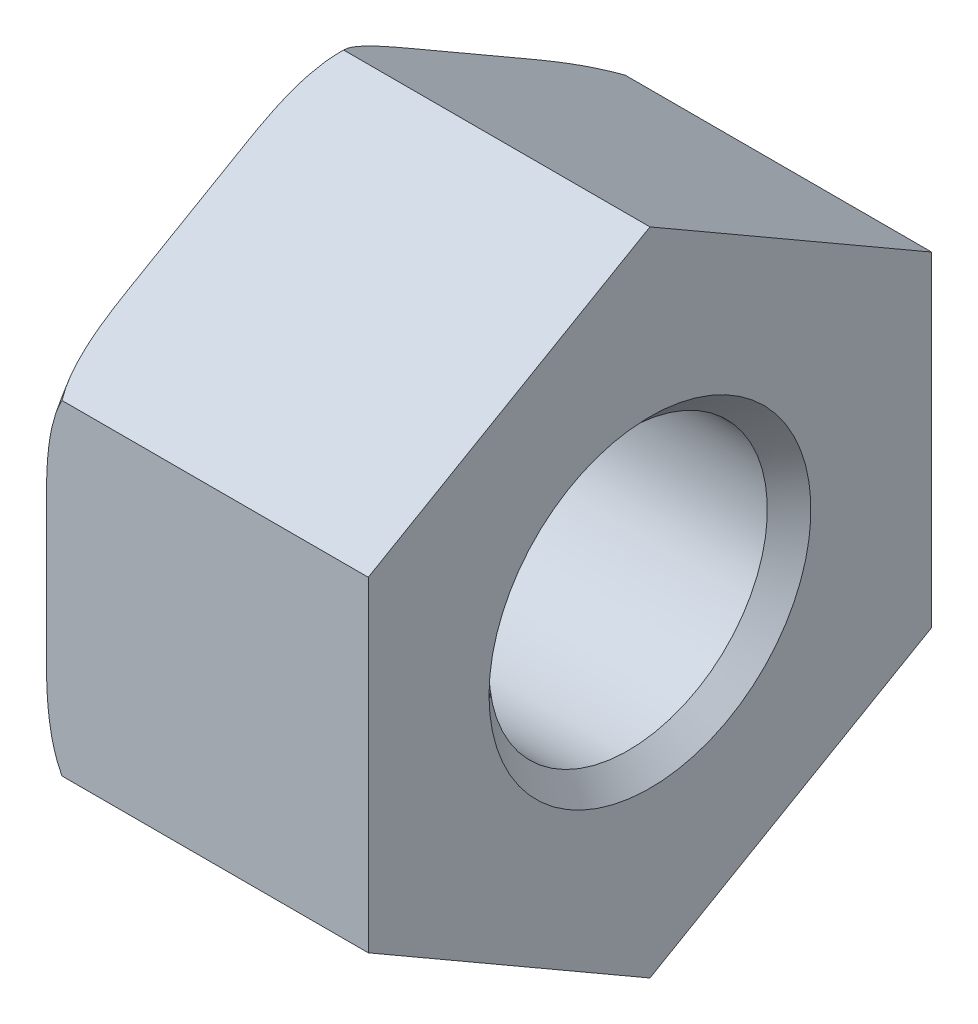
ISO-10303-21;
HEADER;
FILE_DESCRIPTION(('STEP AP214'),'2;1');
FILE_NAME('part.step','',(''),(''),'','','');
FILE_SCHEMA(('AUTOMOTIVE_DESIGN { 1 0 10303 214 1 1 1 1 }'));
ENDSEC;
DATA;
#1=APPLICATION_CONTEXT('core data for automotive mechanical design processes');
#2=APPLICATION_PROTOCOL_DEFINITION('international standard','automotive_design',2000,#1);
#3=PRODUCT_CONTEXT('',#1,'mechanical');
#4=PRODUCT('Part','Part','',(#3));
#5=PRODUCT_RELATED_PRODUCT_CATEGORY('part','',(#4));
#6=PRODUCT_DEFINITION_FORMATION('','',#4);
#7=PRODUCT_DEFINITION_CONTEXT('part definition',#1,'design');
#8=PRODUCT_DEFINITION('design','',#6,#7);
#9=PRODUCT_DEFINITION_SHAPE('','',#8);
#10=(LENGTH_UNIT() NAMED_UNIT(*) SI_UNIT(.MILLI.,.METRE.));
#11=(NAMED_UNIT(*) PLANE_ANGLE_UNIT() SI_UNIT($,.RADIAN.));
#12=(NAMED_UNIT(*) SI_UNIT($,.STERADIAN.) SOLID_ANGLE_UNIT());
#13=UNCERTAINTY_MEASURE_WITH_UNIT(LENGTH_MEASURE(1.E-05),#10,'distance_accuracy_value','');
#14=(GEOMETRIC_REPRESENTATION_CONTEXT(3) GLOBAL_UNCERTAINTY_ASSIGNED_CONTEXT((#13)) GLOBAL_UNIT_ASSIGNED_CONTEXT((#10,
#11,#12)) REPRESENTATION_CONTEXT('',''));
#15=CARTESIAN_POINT('',(0.,0.,0.));
#16=DIRECTION('',(0.,0.,1.));
#17=DIRECTION('',(1.,0.,0.));
#18=AXIS2_PLACEMENT_3D('',#15,#16,#17);
#19=CARTESIAN_POINT('',(2.,4.04145188432738,0.));
#20=DIRECTION('',(0.,-0.866025403784439,0.5));
#21=DIRECTION('',(0.,-0.5,-0.866025403784439));
#22=AXIS2_PLACEMENT_3D('',#19,#20,#21);
#23=PLANE('',#22);
#24=CARTESIAN_POINT('',(-1.80634989088691,4.04145188432738,0.));
#25=CARTESIAN_POINT('',(-1.81783862174649,4.03086842270327,-0.0183310932529214));
#26=CARTESIAN_POINT('',(-1.82853336500855,4.02007874790552,-0.0370193581997551));
#27=CARTESIAN_POINT('',(-1.84846631757347,3.99820767446532,-0.0749011686142629));
#28=CARTESIAN_POINT('',(-1.85770898528877,3.98712729571929,-0.0940929475694885));
#29=CARTESIAN_POINT('',(-1.87493292089598,3.96473623926647,-0.13287539498091));
#30=CARTESIAN_POINT('',(-1.88291509877473,3.95342573441573,-0.152465764041649));
#31=CARTESIAN_POINT('',(-1.89768346054286,3.93074778997109,-0.191745116030986));
#32=CARTESIAN_POINT('',(-1.90448167223158,3.91938229694458,-0.211430727405979));
#33=CARTESIAN_POINT('',(-1.9171104004526,3.89650998699946,-0.251046730317397));
#34=CARTESIAN_POINT('',(-1.9229402307188,3.88500307601155,-0.270977284786624));
#35=CARTESIAN_POINT('',(-1.93373254480891,3.86188639244803,-0.311016555221125));
#36=CARTESIAN_POINT('',(-1.93869484680042,3.8502765988429,-0.3311253076106));
#37=CARTESIAN_POINT('',(-1.95149149792549,3.81770291658341,-0.387544580273639));
#38=CARTESIAN_POINT('',(-1.95846514017973,3.79665415394161,-0.424002106605699));
#39=CARTESIAN_POINT('',(-1.97038933603838,3.75441334903892,-0.497165326849758));
#40=CARTESIAN_POINT('',(-1.97533934120471,3.73322126951665,-0.53387108530038));
#41=CARTESIAN_POINT('',(-1.98361108023124,3.69074282887347,-0.607445902720663));
#42=CARTESIAN_POINT('',(-1.9869315236959,3.66945640645997,-0.644315067852212));
#43=CARTESIAN_POINT('',(-1.99233272320532,3.62639683112319,-0.718896440087865));
#44=CARTESIAN_POINT('',(-1.99438596179558,3.60462284999449,-0.756610081685814));
#45=CARTESIAN_POINT('',(-1.99745567841317,3.5610789024268,-0.832030411235169));
#46=CARTESIAN_POINT('',(-1.99847314506668,3.53930895202647,-0.86973707140679));
#47=CARTESIAN_POINT('',(-1.99974139498009,3.49582399485081,-0.945055226599997));
#48=CARTESIAN_POINT('',(-1.99999431507051,3.47410900474213,-0.982666692754078));
#49=CARTESIAN_POINT('',(-2.,3.45239640190435,-1.02027402403368));
#50=B_SPLINE_CURVE_WITH_KNOTS('',3,(#24,#25,#26,#27,#28,#29,#30,#31,#32,#33,#34,#35,#36,#37,#38,
#39,#40,#41,#42,#43,#44,#45,#46,#47,#48,#49),.UNSPECIFIED.,.F.,.F.,(4,2,2,2,2,2,2,2,2,2,2,2,4),
(0.,0.0722112344197849,0.14419622751732,0.216129012451316,0.287281963363904,0.358485125314697,
0.429703193477565,0.557648536624009,0.685628532058089,0.813709707714387,0.944482417824718,
1.07513019030958,1.20541247626749),.UNSPECIFIED.);
#51=CARTESIAN_POINT('',(-1.80634989088691,4.04145188432738,0.));
#52=VERTEX_POINT('',#51);
#53=CARTESIAN_POINT('',(-2.,3.45239640190435,-1.02027402403368));
#54=VERTEX_POINT('',#53);
#55=EDGE_CURVE('E239',#52,#54,#50,.T.);
#56=ORIENTED_EDGE('',*,*,#55,.F.);
#57=DIRECTION('',(-1.,0.,0.));
#58=VECTOR('',#57,1.);
#59=CARTESIAN_POINT('',(2.,4.04145188432738,0.));
#60=LINE('',#59,#58);
#61=CARTESIAN_POINT('',(2.,4.04145188432738,0.));
#62=VERTEX_POINT('',#61);
#63=EDGE_CURVE('E153',#62,#52,#60,.T.);
#64=ORIENTED_EDGE('',*,*,#63,.F.);
#65=DIRECTION('',(0.,0.5,0.866025403784439));
#66=VECTOR('',#65,1.);
#67=CARTESIAN_POINT('',(2.,4.04145188432738,0.));
#68=LINE('',#67,#66);
#69=CARTESIAN_POINT('',(2.,2.02072594216369,-3.5));
#70=VERTEX_POINT('',#69);
#71=EDGE_CURVE('E147',#70,#62,#68,.T.);
#72=ORIENTED_EDGE('',*,*,#71,.F.);
#73=DIRECTION('',(-1.,0.,0.));
#74=VECTOR('',#73,1.);
#75=CARTESIAN_POINT('',(2.,2.02072594216369,-3.5));
#76=LINE('',#75,#74);
#77=CARTESIAN_POINT('',(-1.80634989088691,2.02072594216369,-3.5));
#78=VERTEX_POINT('',#77);
#79=EDGE_CURVE('E151',#70,#78,#76,.T.);
#80=ORIENTED_EDGE('',*,*,#79,.T.);
#81=CARTESIAN_POINT('',(-2.,2.60978142458672,-2.47972597596632));
#82=CARTESIAN_POINT('',(-1.99999279681051,2.58679180770473,-2.5195451604526));
#83=CARTESIAN_POINT('',(-1.99971001746312,2.5637991940644,-2.55936953547639));
#84=CARTESIAN_POINT('',(-1.99827150388803,2.51773082673427,-2.63916228831378));
#85=CARTESIAN_POINT('',(-1.99711234006011,2.49465510178781,-2.67913061634247));
#86=CARTESIAN_POINT('',(-1.99359181377069,2.44849231389778,-2.75908691038729));
#87=CARTESIAN_POINT('',(-1.99122877881935,2.42540527994102,-2.79907482619679));
#88=CARTESIAN_POINT('',(-1.98498834259843,2.37981575983831,-2.87803819130648));
#89=CARTESIAN_POINT('',(-1.98114712528523,2.35731207266693,-2.91701572084375));
#90=CARTESIAN_POINT('',(-1.97154260941606,2.31242884035369,-2.99475575962146));
#91=CARTESIAN_POINT('',(-1.96578155155552,2.29004918126801,-3.0335184662184));
#92=CARTESIAN_POINT('',(-1.95185263590721,2.24549385742031,-3.1106905508581));
#93=CARTESIAN_POINT('',(-1.94368628660028,2.2233180737595,-3.14910013483963));
#94=CARTESIAN_POINT('',(-1.92037545482163,2.17018657823576,-3.24112658456285));
#95=CARTESIAN_POINT('',(-1.90374216915183,2.13937778528848,-3.29448897929212));
#96=CARTESIAN_POINT('',(-1.87609751062025,2.09913200475287,-3.36419671597547));
#97=CARTESIAN_POINT('',(-1.86867320248732,2.08907155769785,-3.38162192142065));
#98=CARTESIAN_POINT('',(-1.85279019180505,2.06914743556683,-3.41613151324703));
#99=CARTESIAN_POINT('',(-1.84433089615542,2.059283877119,-3.43321569762231));
#100=CARTESIAN_POINT('',(-1.82624414522171,2.03979964879718,-3.46696337102228));
#101=CARTESIAN_POINT('',(-1.81661387067167,2.03017963528796,-3.48362572318982));
#102=CARTESIAN_POINT('',(-1.80634989088704,2.02072594216349,-3.49999999999985));
#103=B_SPLINE_CURVE_WITH_KNOTS('',3,(#81,#82,#83,#84,#85,#86,#87,#88,#89,#90,#91,#92,#93,#94,
#95,#96,#97,#98,#99,#100,#101,#102),.UNSPECIFIED.,.F.,.F.,(4,2,2,2,2,2,2,2,2,2,4),(0.,
0.137946077412208,0.276434798590112,0.415116443385935,0.550599568925925,0.685925119212068,
0.821165980007636,1.01212668965685,1.07644656903175,1.14080348112746,1.20531852759574),.UNSPECIFIED.);
#104=CARTESIAN_POINT('',(-2.,2.60978142458672,-2.47972597596632));
#105=VERTEX_POINT('',#104);
#106=EDGE_CURVE('E183',#105,#78,#103,.T.);
#107=ORIENTED_EDGE('',*,*,#106,.F.);
#108=DIRECTION('',(0.,-0.499999999999998,-0.86602540378444));
#109=VECTOR('',#108,1.);
#110=CARTESIAN_POINT('',(-2.,3.45239640190435,-1.02027402403368));
#111=LINE('',#110,#109);
#112=EDGE_CURVE('E59',#54,#105,#111,.T.);
#113=ORIENTED_EDGE('',*,*,#112,.F.);
#114=EDGE_LOOP('',(#56,#64,#72,#80,#107,#113));
#115=FACE_BOUND('',#114,.T.);
#116=ADVANCED_FACE('F42',(#115),#23,.F.);
#117=CARTESIAN_POINT('',(2.,2.02072594216369,3.5));
#118=DIRECTION('',(0.,-0.866025403784439,-0.5));
#119=DIRECTION('',(0.,0.5,-0.866025403784439));
#120=AXIS2_PLACEMENT_3D('',#117,#118,#119);
#121=PLANE('',#120);
#122=CARTESIAN_POINT('',(-1.80634989088691,2.02072594216369,3.5));
#123=CARTESIAN_POINT('',(-1.81783862174649,2.0313094037878,3.48166890674708));
#124=CARTESIAN_POINT('',(-1.82853336500855,2.04209907858555,3.46298064180025));
#125=CARTESIAN_POINT('',(-1.84846631757347,2.06397015202575,3.42509883138574));
#126=CARTESIAN_POINT('',(-1.85770898528877,2.07505053077178,3.40590705243051));
#127=CARTESIAN_POINT('',(-1.87493292089598,2.0974415872246,3.36712460501909));
#128=CARTESIAN_POINT('',(-1.88291509877473,2.10875209207534,3.34753423595835));
#129=CARTESIAN_POINT('',(-1.89768346054286,2.13143003651997,3.30825488396902));
#130=CARTESIAN_POINT('',(-1.90448167223158,2.14279552954649,3.28856927259402));
#131=CARTESIAN_POINT('',(-1.9171104004526,2.16566783949161,3.2489532696826));
#132=CARTESIAN_POINT('',(-1.9229402307188,2.17717475047952,3.22902271521338));
#133=CARTESIAN_POINT('',(-1.93373254480891,2.20029143404304,3.18898344477888));
#134=CARTESIAN_POINT('',(-1.93869484680041,2.21190122764817,3.1688746923894));
#135=CARTESIAN_POINT('',(-1.95149149792549,2.24447490990765,3.11245541972636));
#136=CARTESIAN_POINT('',(-1.95846514017973,2.26552367254946,3.0759978933943));
#137=CARTESIAN_POINT('',(-1.97038933603838,2.30776447745214,3.00283467315024));
#138=CARTESIAN_POINT('',(-1.97533934120471,2.32895655697442,2.96612891469962));
#139=CARTESIAN_POINT('',(-1.98361108023124,2.3714349976176,2.89255409727934));
#140=CARTESIAN_POINT('',(-1.9869315236959,2.3927214200311,2.85568493214779));
#141=CARTESIAN_POINT('',(-1.99233272320532,2.43578099536788,2.78110355991214));
#142=CARTESIAN_POINT('',(-1.99438596179558,2.45755497649658,2.74338991831419));
#143=CARTESIAN_POINT('',(-1.99745567841317,2.50109892406427,2.66796958876483));
#144=CARTESIAN_POINT('',(-1.99847314506668,2.5228688744646,2.63026292859321));
#145=CARTESIAN_POINT('',(-1.9997413949801,2.56635383164026,2.5549447734));
#146=CARTESIAN_POINT('',(-1.99999431507051,2.58806882174894,2.51733330724592));
#147=CARTESIAN_POINT('',(-2.,2.60978142458672,2.47972597596632));
#148=B_SPLINE_CURVE_WITH_KNOTS('',3,(#122,#123,#124,#125,#126,#127,#128,#129,#130,#131,#132,
#133,#134,#135,#136,#137,#138,#139,#140,#141,#142,#143,#144,#145,#146,#147),.UNSPECIFIED.,.F.,
.F.,(4,2,2,2,2,2,2,2,2,2,2,2,4),(0.,0.0722112344197846,0.14419622751732,0.216129012451315,
0.287281963363903,0.358485125314694,0.429703193477561,0.557648536624006,0.685628532058087,
0.813709707714385,0.944482417824717,1.07513019030958,1.20541247626749),.UNSPECIFIED.);
#149=CARTESIAN_POINT('',(-1.80634989088691,2.02072594216369,3.5));
#150=VERTEX_POINT('',#149);
#151=CARTESIAN_POINT('',(-2.,2.60978142458672,2.47972597596632));
#152=VERTEX_POINT('',#151);
#153=EDGE_CURVE('E412',#150,#152,#148,.T.);
#154=ORIENTED_EDGE('',*,*,#153,.F.);
#155=DIRECTION('',(-1.,0.,0.));
#156=VECTOR('',#155,1.);
#157=CARTESIAN_POINT('',(2.,2.02072594216369,3.5));
#158=LINE('',#157,#156);
#159=CARTESIAN_POINT('',(2.,2.02072594216369,3.5));
#160=VERTEX_POINT('',#159);
#161=EDGE_CURVE('E172',#160,#150,#158,.T.);
#162=ORIENTED_EDGE('',*,*,#161,.F.);
#163=DIRECTION('',(0.,-0.5,0.866025403784439));
#164=VECTOR('',#163,1.);
#165=CARTESIAN_POINT('',(2.,2.02072594216369,3.5));
#166=LINE('',#165,#164);
#167=EDGE_CURVE('E156',#62,#160,#166,.T.);
#168=ORIENTED_EDGE('',*,*,#167,.F.);
#169=ORIENTED_EDGE('',*,*,#63,.T.);
#170=CARTESIAN_POINT('',(-2.,3.45239640190435,1.02027402403368));
#171=CARTESIAN_POINT('',(-1.99999279681051,3.47538601878645,0.980454839547465));
#172=CARTESIAN_POINT('',(-1.99971001746312,3.49837863242673,0.940630464523643));
#173=CARTESIAN_POINT('',(-1.99827150388803,3.54444699975674,0.860837711686185));
#174=CARTESIAN_POINT('',(-1.99711234006011,3.56752272470315,0.820869383657463));
#175=CARTESIAN_POINT('',(-1.99359181377069,3.6136855125934,0.74091308961277));
#176=CARTESIAN_POINT('',(-1.99122877881935,3.63677254655045,0.700925173803432));
#177=CARTESIAN_POINT('',(-1.98498834259843,3.68236206665238,0.621961808693298));
#178=CARTESIAN_POINT('',(-1.98114712528523,3.70486575382273,0.58298427915543));
#179=CARTESIAN_POINT('',(-1.97154260941606,3.7497489861388,0.505244240379354));
#180=CARTESIAN_POINT('',(-1.96578155155552,3.77212864522835,0.466481533784647));
#181=CARTESIAN_POINT('',(-1.95185263590721,3.81668396906548,0.38930944913884));
#182=CARTESIAN_POINT('',(-1.94368628660027,3.83885975271187,0.350899865148988));
#183=CARTESIAN_POINT('',(-1.92037545482163,3.89199124823041,0.258873415422757));
#184=CARTESIAN_POINT('',(-1.90374216915183,3.92280004119909,0.205511020705849));
#185=CARTESIAN_POINT('',(-1.87609751062025,3.96304582173938,0.135803284025205));
#186=CARTESIAN_POINT('',(-1.86867320248732,3.97310626879355,0.118378078579532));
#187=CARTESIAN_POINT('',(-1.85279019180505,3.99303039092392,0.08386848675278));
#188=CARTESIAN_POINT('',(-1.84433089615542,4.00289394937194,0.0667843023776117));
#189=CARTESIAN_POINT('',(-1.82624414522172,4.02237817769402,0.0330366289777953));
#190=CARTESIAN_POINT('',(-1.81661387067167,4.0319981912033,0.0163742768102843));
#191=CARTESIAN_POINT('',(-1.80634989088704,4.04145188432715,-1.05709711817337E-13));
#192=B_SPLINE_CURVE_WITH_KNOTS('',3,(#170,#171,#172,#173,#174,#175,#176,#177,#178,#179,#180,
#181,#182,#183,#184,#185,#186,#187,#188,#189,#190,#191),.UNSPECIFIED.,.F.,.F.,(4,2,2,2,2,2,2,2,
2,2,4),(0.,0.13794607741221,0.276434798590115,0.41511644338594,0.550599568925931,
0.685925119212075,0.821165980007645,1.01212668965686,1.07644656903175,1.14080348112746,
1.20531852759575),.UNSPECIFIED.);
#193=CARTESIAN_POINT('',(-2.,3.45239640190435,1.02027402403368));
#194=VERTEX_POINT('',#193);
#195=EDGE_CURVE('E378',#194,#52,#192,.T.);
#196=ORIENTED_EDGE('',*,*,#195,.F.);
#197=DIRECTION('',(0.,0.499999999999998,-0.86602540378444));
#198=VECTOR('',#197,1.);
#199=CARTESIAN_POINT('',(-2.,2.60978142458672,2.47972597596632));
#200=LINE('',#199,#198);
#201=EDGE_CURVE('E413',#152,#194,#200,.T.);
#202=ORIENTED_EDGE('',*,*,#201,.F.);
#203=EDGE_LOOP('',(#154,#162,#168,#169,#196,#202));
#204=FACE_BOUND('',#203,.T.);
#205=ADVANCED_FACE('F207',(#204),#121,.F.);
#206=CARTESIAN_POINT('',(2.,-2.02072594216369,3.5));
#207=DIRECTION('',(0.,0.,-1.));
#208=DIRECTION('',(-1.,0.,0.));
#209=AXIS2_PLACEMENT_3D('',#206,#207,#208);
#210=PLANE('',#209);
#211=CARTESIAN_POINT('',(-1.80634989088691,-2.02072594216369,3.5));
#212=CARTESIAN_POINT('',(-1.81783862174649,-1.99955901891546,3.5));
#213=CARTESIAN_POINT('',(-1.82853336500855,-1.97797966931998,3.5));
#214=CARTESIAN_POINT('',(-1.84846631757347,-1.93423752243957,3.5));
#215=CARTESIAN_POINT('',(-1.85770898528877,-1.91207676494751,3.5));
#216=CARTESIAN_POINT('',(-1.87493292089598,-1.86729465204188,3.5));
#217=CARTESIAN_POINT('',(-1.88291509877473,-1.8446736423404,3.5));
#218=CARTESIAN_POINT('',(-1.89768346054286,-1.79931775345112,3.5));
#219=CARTESIAN_POINT('',(-1.90448167223158,-1.77658676739809,3.5));
#220=CARTESIAN_POINT('',(-1.9171104004526,-1.73084214750784,3.5));
#221=CARTESIAN_POINT('',(-1.9229402307188,-1.70782832553203,3.5));
#222=CARTESIAN_POINT('',(-1.93373254480891,-1.661594958405,3.5));
#223=CARTESIAN_POINT('',(-1.93869484680041,-1.63837537119474,3.5));
#224=CARTESIAN_POINT('',(-1.95149149792549,-1.57322800667576,3.5));
#225=CARTESIAN_POINT('',(-1.95846514017973,-1.53113048139215,3.5));
#226=CARTESIAN_POINT('',(-1.97038933603838,-1.44664887158678,3.5));
#227=CARTESIAN_POINT('',(-1.97533934120471,-1.40426471254223,3.5));
#228=CARTESIAN_POINT('',(-1.98361108023124,-1.31930783125587,3.5));
#229=CARTESIAN_POINT('',(-1.9869315236959,-1.27673498642888,3.5));
#230=CARTESIAN_POINT('',(-1.99233272320532,-1.19061583575531,3.5));
#231=CARTESIAN_POINT('',(-1.99438596179558,-1.14706787349791,3.5));
#232=CARTESIAN_POINT('',(-1.99745567841317,-1.05997997836253,3.5));
#233=CARTESIAN_POINT('',(-1.99847314506668,-1.01644007756188,3.5));
#234=CARTESIAN_POINT('',(-1.9997413949801,-0.929470163210547,3.5));
#235=CARTESIAN_POINT('',(-1.99999431507051,-0.886040182993196,3.5));
#236=CARTESIAN_POINT('',(-2.,-0.842614977317633,3.5));
#237=B_SPLINE_CURVE_WITH_KNOTS('',3,(#211,#212,#213,#214,#215,#216,#217,#218,#219,#220,#221,
#222,#223,#224,#225,#226,#227,#228,#229,#230,#231,#232,#233,#234,#235,#236),.UNSPECIFIED.,.F.,
.F.,(4,2,2,2,2,2,2,2,2,2,2,2,4),(0.,0.0722112344197847,0.14419622751732,0.216129012451316,
0.287281963363903,0.358485125314695,0.429703193477563,0.557648536624008,0.685628532058089,
0.813709707714387,0.944482417824719,1.07513019030958,1.20541247626749),.UNSPECIFIED.);
#238=CARTESIAN_POINT('',(-1.80634989088691,-2.02072594216369,3.5));
#239=VERTEX_POINT('',#238);
#240=CARTESIAN_POINT('',(-2.,-0.842614977317631,3.5));
#241=VERTEX_POINT('',#240);
#242=EDGE_CURVE('E114',#239,#241,#237,.T.);
#243=ORIENTED_EDGE('',*,*,#242,.F.);
#244=DIRECTION('',(-1.,0.,0.));
#245=VECTOR('',#244,1.);
#246=CARTESIAN_POINT('',(2.,-2.02072594216369,3.5));
#247=LINE('',#246,#245);
#248=CARTESIAN_POINT('',(2.,-2.02072594216369,3.5));
#249=VERTEX_POINT('',#248);
#250=EDGE_CURVE('E398',#249,#239,#247,.T.);
#251=ORIENTED_EDGE('',*,*,#250,.F.);
#252=DIRECTION('',(0.,-1.,0.));
#253=VECTOR('',#252,1.);
#254=CARTESIAN_POINT('',(2.,-2.02072594216369,3.5));
#255=LINE('',#254,#253);
#256=EDGE_CURVE('E410',#160,#249,#255,.T.);
#257=ORIENTED_EDGE('',*,*,#256,.F.);
#258=ORIENTED_EDGE('',*,*,#161,.T.);
#259=CARTESIAN_POINT('',(-2.,0.84261497731763,3.5));
#260=CARTESIAN_POINT('',(-1.99999279681051,0.888594211081723,3.50000000000006));
#261=CARTESIAN_POINT('',(-1.99971001746312,0.934579438362329,3.50000000000003));
#262=CARTESIAN_POINT('',(-1.99827150388803,1.02671617302247,3.49999999999997));
#263=CARTESIAN_POINT('',(-1.99711234006011,1.07286762291533,3.49999999999994));
#264=CARTESIAN_POINT('',(-1.99359181377069,1.16519319869562,3.50000000000007));
#265=CARTESIAN_POINT('',(-1.99122877881935,1.21136726660943,3.50000000000023));
#266=CARTESIAN_POINT('',(-1.98498834259843,1.30254630681407,3.49999999999978));
#267=CARTESIAN_POINT('',(-1.98114712528523,1.3475536811558,3.49999999999918));
#268=CARTESIAN_POINT('',(-1.97154260941606,1.4373201457851,3.50000000000082));
#269=CARTESIAN_POINT('',(-1.96578155155552,1.48207946396034,3.50000000000305));
#270=CARTESIAN_POINT('',(-1.95185263590721,1.57119011164518,3.49999999999695));
#271=CARTESIAN_POINT('',(-1.94368628660027,1.61554167895237,3.49999999998862));
#272=CARTESIAN_POINT('',(-1.92037545482163,1.72180466999465,3.49999999998562));
#273=CARTESIAN_POINT('',(-1.90374216915183,1.78342225591061,3.49999999999798));
#274=CARTESIAN_POINT('',(-1.87609751062025,1.86391381698651,3.50000000000068));
#275=CARTESIAN_POINT('',(-1.86867320248732,1.88403471109571,3.50000000000019));
#276=CARTESIAN_POINT('',(-1.85279019180505,1.92388295535709,3.49999999999981));
#277=CARTESIAN_POINT('',(-1.84433089615542,1.94361007225293,3.49999999999993));
#278=CARTESIAN_POINT('',(-1.82624414522171,1.98257852889683,3.50000000000007));
#279=CARTESIAN_POINT('',(-1.81661387067167,2.00181855591534,3.50000000000011));
#280=CARTESIAN_POINT('',(-1.80634989088704,2.02072594216367,3.49999999999975));
#281=B_SPLINE_CURVE_WITH_KNOTS('',3,(#259,#260,#261,#262,#263,#264,#265,#266,#267,#268,#269,
#270,#271,#272,#273,#274,#275,#276,#277,#278,#279,#280),.UNSPECIFIED.,.F.,.F.,(4,2,2,2,2,2,2,2,
2,2,4),(0.,0.13794607741221,0.276434798590115,0.41511644338594,0.550599568925931,
0.685925119212075,0.821165980007645,1.01212668965686,1.07644656903175,1.14080348112746,
1.20531852759575),.UNSPECIFIED.);
#282=CARTESIAN_POINT('',(-2.,0.84261497731763,3.5));
#283=VERTEX_POINT('',#282);
#284=EDGE_CURVE('E241',#283,#150,#281,.T.);
#285=ORIENTED_EDGE('',*,*,#284,.F.);
#286=DIRECTION('',(0.,1.,0.));
#287=VECTOR('',#286,1.);
#288=CARTESIAN_POINT('',(-2.,1.8,3.5));
#289=LINE('',#288,#287);
#290=EDGE_CURVE('E478',#241,#283,#289,.T.);
#291=ORIENTED_EDGE('',*,*,#290,.F.);
#292=EDGE_LOOP('',(#243,#251,#257,#258,#285,#291));
#293=FACE_BOUND('',#292,.T.);
#294=ADVANCED_FACE('F212',(#293),#210,.F.);
#295=CARTESIAN_POINT('',(2.,-4.04145188432738,0.));
#296=DIRECTION('',(0.,0.866025403784439,-0.5));
#297=DIRECTION('',(0.,0.5,0.866025403784439));
#298=AXIS2_PLACEMENT_3D('',#295,#296,#297);
#299=PLANE('',#298);
#300=CARTESIAN_POINT('',(-1.80634989088691,-4.04145188432738,0.));
#301=CARTESIAN_POINT('',(-1.81783862174649,-4.03086842270327,0.0183310932529215));
#302=CARTESIAN_POINT('',(-1.82853336500855,-4.02007874790552,0.0370193581997551));
#303=CARTESIAN_POINT('',(-1.84846631757347,-3.99820767446532,0.0749011686142626));
#304=CARTESIAN_POINT('',(-1.85770898528877,-3.98712729571929,0.094092947569488));
#305=CARTESIAN_POINT('',(-1.87493292089598,-3.96473623926647,0.132875394980909));
#306=CARTESIAN_POINT('',(-1.88291509877473,-3.95342573441573,0.152465764041649));
#307=CARTESIAN_POINT('',(-1.89768346054286,-3.93074778997109,0.191745116030985));
#308=CARTESIAN_POINT('',(-1.90448167223158,-3.91938229694458,0.211430727405978));
#309=CARTESIAN_POINT('',(-1.9171104004526,-3.89650998699946,0.251046730317396));
#310=CARTESIAN_POINT('',(-1.9229402307188,-3.88500307601155,0.270977284786622));
#311=CARTESIAN_POINT('',(-1.93373254480891,-3.86188639244803,0.311016555221124));
#312=CARTESIAN_POINT('',(-1.93869484680041,-3.8502765988429,0.331125307610598));
#313=CARTESIAN_POINT('',(-1.95149149792549,-3.81770291658341,0.387544580273636));
#314=CARTESIAN_POINT('',(-1.95846514017973,-3.79665415394161,0.424002106605697));
#315=CARTESIAN_POINT('',(-1.97038933603838,-3.75441334903893,0.497165326849756));
#316=CARTESIAN_POINT('',(-1.97533934120471,-3.73322126951665,0.533871085300378));
#317=CARTESIAN_POINT('',(-1.98361108023124,-3.69074282887347,0.607445902720661));
#318=CARTESIAN_POINT('',(-1.9869315236959,-3.66945640645997,0.644315067852211));
#319=CARTESIAN_POINT('',(-1.99233272320532,-3.62639683112319,0.718896440087864));
#320=CARTESIAN_POINT('',(-1.99438596179558,-3.60462284999449,0.756610081685813));
#321=CARTESIAN_POINT('',(-1.99745567841317,-3.5610789024268,0.832030411235168));
#322=CARTESIAN_POINT('',(-1.99847314506668,-3.53930895202647,0.869737071406789));
#323=CARTESIAN_POINT('',(-1.9997413949801,-3.49582399485081,0.945055226599997));
#324=CARTESIAN_POINT('',(-1.99999431507051,-3.47410900474213,0.982666692754078));
#325=CARTESIAN_POINT('',(-2.,-3.45239640190435,1.02027402403368));
#326=B_SPLINE_CURVE_WITH_KNOTS('',3,(#300,#301,#302,#303,#304,#305,#306,#307,#308,#309,#310,
#311,#312,#313,#314,#315,#316,#317,#318,#319,#320,#321,#322,#323,#324,#325),.UNSPECIFIED.,.F.,
.F.,(4,2,2,2,2,2,2,2,2,2,2,2,4),(0.,0.0722112344197847,0.14419622751732,0.216129012451316,
0.287281963363903,0.358485125314695,0.429703193477562,0.557648536624007,0.685628532058087,
0.813709707714385,0.944482417824717,1.07513019030958,1.20541247626749),.UNSPECIFIED.);
#327=CARTESIAN_POINT('',(-1.80634989088691,-4.04145188432738,0.));
#328=VERTEX_POINT('',#327);
#329=CARTESIAN_POINT('',(-2.,-3.45239640190435,1.02027402403368));
#330=VERTEX_POINT('',#329);
#331=EDGE_CURVE('E107',#328,#330,#326,.T.);
#332=ORIENTED_EDGE('',*,*,#331,.F.);
#333=DIRECTION('',(-1.,0.,0.));
#334=VECTOR('',#333,1.);
#335=CARTESIAN_POINT('',(2.,-4.04145188432738,0.));
#336=LINE('',#335,#334);
#337=CARTESIAN_POINT('',(2.,-4.04145188432738,0.));
#338=VERTEX_POINT('',#337);
#339=EDGE_CURVE('E393',#338,#328,#336,.T.);
#340=ORIENTED_EDGE('',*,*,#339,.F.);
#341=DIRECTION('',(0.,-0.5,-0.866025403784439));
#342=VECTOR('',#341,1.);
#343=CARTESIAN_POINT('',(2.,-4.04145188432738,0.));
#344=LINE('',#343,#342);
#345=EDGE_CURVE('E645',#249,#338,#344,.T.);
#346=ORIENTED_EDGE('',*,*,#345,.F.);
#347=ORIENTED_EDGE('',*,*,#250,.T.);
#348=CARTESIAN_POINT('',(-2.,-2.60978142458672,2.47972597596632));
#349=CARTESIAN_POINT('',(-1.99999279681051,-2.58679180770473,2.5195451604526));
#350=CARTESIAN_POINT('',(-1.99971001746312,-2.5637991940644,2.55936953547639));
#351=CARTESIAN_POINT('',(-1.99827150388803,-2.51773082673427,2.63916228831378));
#352=CARTESIAN_POINT('',(-1.99711234006011,-2.49465510178781,2.67913061634247));
#353=CARTESIAN_POINT('',(-1.99359181377069,-2.44849231389778,2.75908691038729));
#354=CARTESIAN_POINT('',(-1.99122877881935,-2.42540527994102,2.79907482619679));
#355=CARTESIAN_POINT('',(-1.98498834259843,-2.3798157598383,2.87803819130648));
#356=CARTESIAN_POINT('',(-1.98114712528523,-2.35731207266693,2.91701572084375));
#357=CARTESIAN_POINT('',(-1.97154260941606,-2.31242884035369,2.99475575962146));
#358=CARTESIAN_POINT('',(-1.96578155155552,-2.29004918126801,3.0335184662184));
#359=CARTESIAN_POINT('',(-1.95185263590721,-2.24549385742031,3.11069055085811));
#360=CARTESIAN_POINT('',(-1.94368628660028,-2.2233180737595,3.14910013483963));
#361=CARTESIAN_POINT('',(-1.92037545482163,-2.17018657823575,3.24112658456286));
#362=CARTESIAN_POINT('',(-1.90374216915183,-2.13937778528848,3.29448897929213));
#363=CARTESIAN_POINT('',(-1.87609751062025,-2.09913200475287,3.36419671597547));
#364=CARTESIAN_POINT('',(-1.86867320248732,-2.08907155769784,3.38162192142065));
#365=CARTESIAN_POINT('',(-1.85279019180505,-2.06914743556683,3.41613151324703));
#366=CARTESIAN_POINT('',(-1.84433089615542,-2.05928387711901,3.43321569762231));
#367=CARTESIAN_POINT('',(-1.82624414522171,-2.03979964879718,3.46696337102228));
#368=CARTESIAN_POINT('',(-1.81661387067167,-2.03017963528796,3.48362572318982));
#369=CARTESIAN_POINT('',(-1.80634989088704,-2.02072594216349,3.49999999999986));
#370=B_SPLINE_CURVE_WITH_KNOTS('',3,(#348,#349,#350,#351,#352,#353,#354,#355,#356,#357,#358,
#359,#360,#361,#362,#363,#364,#365,#366,#367,#368,#369),.UNSPECIFIED.,.F.,.F.,(4,2,2,2,2,2,2,2,
2,2,4),(0.,0.137946077412209,0.276434798590113,0.415116443385938,0.550599568925929,
0.685925119212071,0.821165980007641,1.01212668965686,1.07644656903175,1.14080348112746,
1.20531852759575),.UNSPECIFIED.);
#371=CARTESIAN_POINT('',(-2.,-2.60978142458672,2.47972597596632));
#372=VERTEX_POINT('',#371);
#373=EDGE_CURVE('E498',#372,#239,#370,.T.);
#374=ORIENTED_EDGE('',*,*,#373,.F.);
#375=DIRECTION('',(0.,0.499999999999998,0.866025403784439));
#376=VECTOR('',#375,1.);
#377=CARTESIAN_POINT('',(-2.,-3.45239640190435,1.02027402403368));
#378=LINE('',#377,#376);
#379=EDGE_CURVE('E479',#330,#372,#378,.T.);
#380=ORIENTED_EDGE('',*,*,#379,.F.);
#381=EDGE_LOOP('',(#332,#340,#346,#347,#374,#380));
#382=FACE_BOUND('',#381,.T.);
#383=ADVANCED_FACE('F512',(#382),#299,.F.);
#384=CARTESIAN_POINT('',(2.,-2.02072594216369,-3.5));
#385=DIRECTION('',(0.,0.866025403784439,0.5));
#386=DIRECTION('',(0.,-0.5,0.866025403784439));
#387=AXIS2_PLACEMENT_3D('',#384,#385,#386);
#388=PLANE('',#387);
#389=CARTESIAN_POINT('',(-1.80634989088691,-2.02072594216369,-3.5));
#390=CARTESIAN_POINT('',(-1.81783862174649,-2.0313094037878,-3.48166890674708));
#391=CARTESIAN_POINT('',(-1.82853336500855,-2.04209907858555,-3.46298064180025));
#392=CARTESIAN_POINT('',(-1.84846631757347,-2.06397015202575,-3.42509883138574));
#393=CARTESIAN_POINT('',(-1.85770898528877,-2.07505053077178,-3.40590705243051));
#394=CARTESIAN_POINT('',(-1.87493292089598,-2.0974415872246,-3.36712460501909));
#395=CARTESIAN_POINT('',(-1.88291509877473,-2.10875209207534,-3.34753423595835));
#396=CARTESIAN_POINT('',(-1.89768346054286,-2.13143003651997,-3.30825488396902));
#397=CARTESIAN_POINT('',(-1.90448167223158,-2.14279552954649,-3.28856927259402));
#398=CARTESIAN_POINT('',(-1.9171104004526,-2.16566783949161,-3.2489532696826));
#399=CARTESIAN_POINT('',(-1.9229402307188,-2.17717475047952,-3.22902271521338));
#400=CARTESIAN_POINT('',(-1.93373254480891,-2.20029143404304,-3.18898344477888));
#401=CARTESIAN_POINT('',(-1.93869484680042,-2.21190122764817,-3.1688746923894));
#402=CARTESIAN_POINT('',(-1.95149149792549,-2.24447490990765,-3.11245541972636));
#403=CARTESIAN_POINT('',(-1.95846514017973,-2.26552367254946,-3.0759978933943));
#404=CARTESIAN_POINT('',(-1.97038933603838,-2.30776447745215,-3.00283467315024));
#405=CARTESIAN_POINT('',(-1.97533934120471,-2.32895655697442,-2.96612891469962));
#406=CARTESIAN_POINT('',(-1.98361108023124,-2.3714349976176,-2.89255409727934));
#407=CARTESIAN_POINT('',(-1.9869315236959,-2.3927214200311,-2.85568493214779));
#408=CARTESIAN_POINT('',(-1.99233272320532,-2.43578099536788,-2.78110355991213));
#409=CARTESIAN_POINT('',(-1.99438596179558,-2.45755497649658,-2.74338991831419));
#410=CARTESIAN_POINT('',(-1.99745567841317,-2.50109892406427,-2.66796958876483));
#411=CARTESIAN_POINT('',(-1.99847314506668,-2.5228688744646,-2.63026292859321));
#412=CARTESIAN_POINT('',(-1.9997413949801,-2.56635383164026,-2.5549447734));
#413=CARTESIAN_POINT('',(-1.99999431507051,-2.58806882174894,-2.51733330724592));
#414=CARTESIAN_POINT('',(-2.,-2.60978142458672,-2.47972597596632));
#415=B_SPLINE_CURVE_WITH_KNOTS('',3,(#389,#390,#391,#392,#393,#394,#395,#396,#397,#398,#399,
#400,#401,#402,#403,#404,#405,#406,#407,#408,#409,#410,#411,#412,#413,#414),.UNSPECIFIED.,.F.,
.F.,(4,2,2,2,2,2,2,2,2,2,2,2,4),(0.,0.0722112344197848,0.14419622751732,0.216129012451316,
0.287281963363903,0.358485125314696,0.429703193477563,0.557648536624008,0.685628532058089,
0.813709707714387,0.944482417824718,1.07513019030958,1.20541247626749),.UNSPECIFIED.);
#416=CARTESIAN_POINT('',(-1.80634989088691,-2.02072594216369,-3.5));
#417=VERTEX_POINT('',#416);
#418=CARTESIAN_POINT('',(-2.,-2.60978142458672,-2.47972597596632));
#419=VERTEX_POINT('',#418);
#420=EDGE_CURVE('E96',#417,#419,#415,.T.);
#421=ORIENTED_EDGE('',*,*,#420,.F.);
#422=DIRECTION('',(-1.,0.,0.));
#423=VECTOR('',#422,1.);
#424=CARTESIAN_POINT('',(2.,-2.02072594216369,-3.5));
#425=LINE('',#424,#423);
#426=CARTESIAN_POINT('',(2.,-2.02072594216369,-3.5));
#427=VERTEX_POINT('',#426);
#428=EDGE_CURVE('E391',#427,#417,#425,.T.);
#429=ORIENTED_EDGE('',*,*,#428,.F.);
#430=DIRECTION('',(0.,0.5,-0.866025403784439));
#431=VECTOR('',#430,1.);
#432=CARTESIAN_POINT('',(2.,-2.02072594216369,-3.5));
#433=LINE('',#432,#431);
#434=EDGE_CURVE('E162',#338,#427,#433,.T.);
#435=ORIENTED_EDGE('',*,*,#434,.F.);
#436=ORIENTED_EDGE('',*,*,#339,.T.);
#437=CARTESIAN_POINT('',(-2.,-3.45239640190435,-1.02027402403368));
#438=CARTESIAN_POINT('',(-1.99999279681051,-3.47538601878645,-0.980454839547465));
#439=CARTESIAN_POINT('',(-1.99971001746312,-3.49837863242673,-0.940630464523643));
#440=CARTESIAN_POINT('',(-1.99827150388803,-3.54444699975674,-0.860837711686185));
#441=CARTESIAN_POINT('',(-1.99711234006011,-3.56752272470315,-0.820869383657463));
#442=CARTESIAN_POINT('',(-1.99359181377069,-3.6136855125934,-0.74091308961277));
#443=CARTESIAN_POINT('',(-1.99122877881935,-3.63677254655045,-0.700925173803432));
#444=CARTESIAN_POINT('',(-1.98498834259843,-3.68236206665238,-0.621961808693298));
#445=CARTESIAN_POINT('',(-1.98114712528523,-3.70486575382273,-0.58298427915543));
#446=CARTESIAN_POINT('',(-1.97154260941606,-3.7497489861388,-0.505244240379355));
#447=CARTESIAN_POINT('',(-1.96578155155552,-3.77212864522835,-0.466481533784647));
#448=CARTESIAN_POINT('',(-1.95185263590721,-3.81668396906548,-0.38930944913884));
#449=CARTESIAN_POINT('',(-1.94368628660027,-3.83885975271187,-0.350899865148989));
#450=CARTESIAN_POINT('',(-1.92037545482163,-3.89199124823041,-0.258873415422757));
#451=CARTESIAN_POINT('',(-1.90374216915183,-3.92280004119909,-0.205511020705849));
#452=CARTESIAN_POINT('',(-1.87609751062025,-3.96304582173938,-0.135803284025205));
#453=CARTESIAN_POINT('',(-1.86867320248732,-3.97310626879355,-0.118378078579533));
#454=CARTESIAN_POINT('',(-1.85279019180505,-3.99303039092392,-0.0838684867527816));
#455=CARTESIAN_POINT('',(-1.84433089615542,-4.00289394937194,-0.0667843023776135));
#456=CARTESIAN_POINT('',(-1.82624414522172,-4.02237817769402,-0.033036628977797));
#457=CARTESIAN_POINT('',(-1.81661387067167,-4.0319981912033,-0.0163742768102858));
#458=CARTESIAN_POINT('',(-1.80634989088704,-4.04145188432715,1.04950770296597E-13));
#459=B_SPLINE_CURVE_WITH_KNOTS('',3,(#437,#438,#439,#440,#441,#442,#443,#444,#445,#446,#447,
#448,#449,#450,#451,#452,#453,#454,#455,#456,#457,#458),.UNSPECIFIED.,.F.,.F.,(4,2,2,2,2,2,2,2,
2,2,4),(0.,0.13794607741221,0.276434798590114,0.41511644338594,0.550599568925931,
0.685925119212075,0.821165980007645,1.01212668965686,1.07644656903175,1.14080348112746,
1.20531852759574),.UNSPECIFIED.);
#460=CARTESIAN_POINT('',(-2.,-3.45239640190435,-1.02027402403368));
#461=VERTEX_POINT('',#460);
#462=EDGE_CURVE('E492',#461,#328,#459,.T.);
#463=ORIENTED_EDGE('',*,*,#462,.F.);
#464=DIRECTION('',(0.,-0.499999999999998,0.866025403784439));
#465=VECTOR('',#464,1.);
#466=CARTESIAN_POINT('',(-2.,-2.60978142458672,-2.47972597596632));
#467=LINE('',#466,#465);
#468=EDGE_CURVE('E430',#419,#461,#467,.T.);
#469=ORIENTED_EDGE('',*,*,#468,.F.);
#470=EDGE_LOOP('',(#421,#429,#435,#436,#463,#469));
#471=FACE_BOUND('',#470,.T.);
#472=ADVANCED_FACE('F382',(#471),#388,.F.);
#473=CARTESIAN_POINT('',(2.,2.02072594216369,-3.5));
#474=DIRECTION('',(0.,0.,1.));
#475=DIRECTION('',(1.,0.,0.));
#476=AXIS2_PLACEMENT_3D('',#473,#474,#475);
#477=PLANE('',#476);
#478=CARTESIAN_POINT('',(-1.80634989088691,2.02072594216369,-3.5));
#479=CARTESIAN_POINT('',(-1.81783862174649,1.99955901891546,-3.5));
#480=CARTESIAN_POINT('',(-1.82853336500855,1.97797966931998,-3.5));
#481=CARTESIAN_POINT('',(-1.84846631757347,1.93423752243957,-3.5));
#482=CARTESIAN_POINT('',(-1.85770898528877,1.91207676494751,-3.5));
#483=CARTESIAN_POINT('',(-1.87493292089598,1.86729465204188,-3.5));
#484=CARTESIAN_POINT('',(-1.88291509877473,1.84467364234039,-3.5));
#485=CARTESIAN_POINT('',(-1.89768346054286,1.79931775345112,-3.5));
#486=CARTESIAN_POINT('',(-1.90448167223158,1.77658676739809,-3.5));
#487=CARTESIAN_POINT('',(-1.9171104004526,1.73084214750784,-3.5));
#488=CARTESIAN_POINT('',(-1.9229402307188,1.70782832553203,-3.5));
#489=CARTESIAN_POINT('',(-1.93373254480891,1.661594958405,-3.5));
#490=CARTESIAN_POINT('',(-1.93869484680042,1.63837537119473,-3.5));
#491=CARTESIAN_POINT('',(-1.95149149792549,1.57322800667576,-3.5));
#492=CARTESIAN_POINT('',(-1.95846514017973,1.53113048139215,-3.5));
#493=CARTESIAN_POINT('',(-1.97038933603838,1.44664887158678,-3.5));
#494=CARTESIAN_POINT('',(-1.97533934120471,1.40426471254222,-3.5));
#495=CARTESIAN_POINT('',(-1.98361108023124,1.31930783125587,-3.5));
#496=CARTESIAN_POINT('',(-1.9869315236959,1.27673498642887,-3.5));
#497=CARTESIAN_POINT('',(-1.99233272320532,1.1906158357553,-3.5));
#498=CARTESIAN_POINT('',(-1.99438596179558,1.14706787349791,-3.5));
#499=CARTESIAN_POINT('',(-1.99745567841317,1.05997997836253,-3.5));
#500=CARTESIAN_POINT('',(-1.99847314506668,1.01644007756187,-3.5));
#501=CARTESIAN_POINT('',(-1.9997413949801,0.929470163210545,-3.5));
#502=CARTESIAN_POINT('',(-1.99999431507051,0.886040182993194,-3.5));
#503=CARTESIAN_POINT('',(-2.,0.84261497731763,-3.5));
#504=B_SPLINE_CURVE_WITH_KNOTS('',3,(#478,#479,#480,#481,#482,#483,#484,#485,#486,#487,#488,
#489,#490,#491,#492,#493,#494,#495,#496,#497,#498,#499,#500,#501,#502,#503),.UNSPECIFIED.,.F.,
.F.,(4,2,2,2,2,2,2,2,2,2,2,2,4),(0.,0.0722112344197851,0.144196227517321,0.216129012451317,
0.287281963363906,0.358485125314698,0.429703193477566,0.55764853662401,0.685628532058091,
0.813709707714389,0.94448241782472,1.07513019030958,1.20541247626749),.UNSPECIFIED.);
#505=CARTESIAN_POINT('',(-2.,0.84261497731763,-3.5));
#506=VERTEX_POINT('',#505);
#507=EDGE_CURVE('E167',#78,#506,#504,.T.);
#508=ORIENTED_EDGE('',*,*,#507,.F.);
#509=ORIENTED_EDGE('',*,*,#79,.F.);
#510=DIRECTION('',(0.,1.,0.));
#511=VECTOR('',#510,1.);
#512=CARTESIAN_POINT('',(2.,2.02072594216369,-3.5));
#513=LINE('',#512,#511);
#514=EDGE_CURVE('E157',#427,#70,#513,.T.);
#515=ORIENTED_EDGE('',*,*,#514,.F.);
#516=ORIENTED_EDGE('',*,*,#428,.T.);
#517=CARTESIAN_POINT('',(-2.,-0.842614977317629,-3.5));
#518=CARTESIAN_POINT('',(-1.99999279681051,-0.888594211081723,-3.50000000000006));
#519=CARTESIAN_POINT('',(-1.99971001746312,-0.934579438362328,-3.50000000000003));
#520=CARTESIAN_POINT('',(-1.99827150388803,-1.02671617302247,-3.49999999999997));
#521=CARTESIAN_POINT('',(-1.99711234006011,-1.07286762291533,-3.49999999999994));
#522=CARTESIAN_POINT('',(-1.99359181377069,-1.16519319869562,-3.50000000000007));
#523=CARTESIAN_POINT('',(-1.99122877881935,-1.21136726660942,-3.50000000000023));
#524=CARTESIAN_POINT('',(-1.98498834259843,-1.30254630681407,-3.49999999999978));
#525=CARTESIAN_POINT('',(-1.98114712528523,-1.3475536811558,-3.49999999999918));
#526=CARTESIAN_POINT('',(-1.97154260941606,-1.4373201457851,-3.50000000000082));
#527=CARTESIAN_POINT('',(-1.96578155155552,-1.48207946396034,-3.50000000000305));
#528=CARTESIAN_POINT('',(-1.95185263590721,-1.57119011164518,-3.49999999999695));
#529=CARTESIAN_POINT('',(-1.94368628660027,-1.61554167895237,-3.49999999998862));
#530=CARTESIAN_POINT('',(-1.92037545482163,-1.72180466999465,-3.49999999998562));
#531=CARTESIAN_POINT('',(-1.90374216915183,-1.78342225591061,-3.49999999999798));
#532=CARTESIAN_POINT('',(-1.87609751062025,-1.86391381698651,-3.50000000000068));
#533=CARTESIAN_POINT('',(-1.86867320248732,-1.88403471109571,-3.50000000000019));
#534=CARTESIAN_POINT('',(-1.85279019180505,-1.92388295535709,-3.49999999999981));
#535=CARTESIAN_POINT('',(-1.84433089615542,-1.94361007225293,-3.49999999999993));
#536=CARTESIAN_POINT('',(-1.82624414522171,-1.98257852889683,-3.50000000000007));
#537=CARTESIAN_POINT('',(-1.81661387067167,-2.00181855591534,-3.50000000000011));
#538=CARTESIAN_POINT('',(-1.80634989088704,-2.02072594216367,-3.49999999999975));
#539=B_SPLINE_CURVE_WITH_KNOTS('',3,(#517,#518,#519,#520,#521,#522,#523,#524,#525,#526,#527,
#528,#529,#530,#531,#532,#533,#534,#535,#536,#537,#538),.UNSPECIFIED.,.F.,.F.,(4,2,2,2,2,2,2,2,
2,2,4),(0.,0.13794607741221,0.276434798590115,0.41511644338594,0.550599568925931,
0.685925119212075,0.821165980007645,1.01212668965686,1.07644656903175,1.14080348112746,
1.20531852759575),.UNSPECIFIED.);
#540=CARTESIAN_POINT('',(-2.,-0.84261497731763,-3.5));
#541=VERTEX_POINT('',#540);
#542=EDGE_CURVE('E101',#541,#417,#539,.T.);
#543=ORIENTED_EDGE('',*,*,#542,.F.);
#544=DIRECTION('',(0.,1.,0.));
#545=VECTOR('',#544,1.);
#546=CARTESIAN_POINT('',(-2.,1.8,-3.5));
#547=LINE('',#546,#545);
#548=EDGE_CURVE('E421',#506,#541,#547,.F.);
#549=ORIENTED_EDGE('',*,*,#548,.F.);
#550=EDGE_LOOP('',(#508,#509,#515,#516,#543,#549));
#551=FACE_BOUND('',#550,.T.);
#552=ADVANCED_FACE('F165',(#551),#477,.F.);
#553=CARTESIAN_POINT('',(-1.4,0.,0.));
#554=DIRECTION('',(-1.,0.,0.));
#555=DIRECTION('',(0.,0.,1.));
#556=AXIS2_PLACEMENT_3D('',#553,#554,#555);
#557=TOROIDAL_SURFACE('',#556,3.6,0.600000000000001);
#558=ORIENTED_EDGE('',*,*,#420,.T.);
#559=CARTESIAN_POINT('',(-2.,0.,0.));
#560=DIRECTION('',(1.,0.,0.));
#561=DIRECTION('',(0.,-0.724939284607422,-0.688812771101755));
#562=AXIS2_PLACEMENT_3D('',#559,#560,#561);
#563=CIRCLE('',#562,3.6);
#564=EDGE_CURVE('E425',#541,#419,#563,.F.);
#565=ORIENTED_EDGE('',*,*,#564,.F.);
#566=ORIENTED_EDGE('',*,*,#542,.T.);
#567=EDGE_LOOP('',(#558,#565,#566));
#568=FACE_BOUND('',#567,.T.);
#569=ADVANCED_FACE('F340',(#568),#557,.T.);
#570=CARTESIAN_POINT('',(-1.4,0.,0.));
#571=DIRECTION('',(-1.,0.,0.));
#572=DIRECTION('',(0.,0.,1.));
#573=AXIS2_PLACEMENT_3D('',#570,#571,#572);
#574=TOROIDAL_SURFACE('',#573,3.6,0.600000000000001);
#575=ORIENTED_EDGE('',*,*,#331,.T.);
#576=CARTESIAN_POINT('',(-2.,0.,0.));
#577=DIRECTION('',(1.,0.,0.));
#578=DIRECTION('',(0.,-0.958999000528987,0.283409451120467));
#579=AXIS2_PLACEMENT_3D('',#576,#577,#578);
#580=CIRCLE('',#579,3.6);
#581=EDGE_CURVE('E327',#461,#330,#580,.F.);
#582=ORIENTED_EDGE('',*,*,#581,.F.);
#583=ORIENTED_EDGE('',*,*,#462,.T.);
#584=EDGE_LOOP('',(#575,#582,#583));
#585=FACE_BOUND('',#584,.T.);
#586=ADVANCED_FACE('F299',(#585),#574,.T.);
#587=CARTESIAN_POINT('',(-1.4,0.,0.));
#588=DIRECTION('',(-1.,0.,0.));
#589=DIRECTION('',(0.,0.,1.));
#590=AXIS2_PLACEMENT_3D('',#587,#588,#589);
#591=TOROIDAL_SURFACE('',#590,3.6,0.600000000000001);
#592=ORIENTED_EDGE('',*,*,#242,.T.);
#593=CARTESIAN_POINT('',(-2.,0.,0.));
#594=DIRECTION('',(1.,0.,0.));
#595=DIRECTION('',(0.,-0.234059715921565,0.972222222222222));
#596=AXIS2_PLACEMENT_3D('',#593,#594,#595);
#597=CIRCLE('',#596,3.6);
#598=EDGE_CURVE('E459',#372,#241,#597,.F.);
#599=ORIENTED_EDGE('',*,*,#598,.F.);
#600=ORIENTED_EDGE('',*,*,#373,.T.);
#601=EDGE_LOOP('',(#592,#599,#600));
#602=FACE_BOUND('',#601,.T.);
#603=ADVANCED_FACE('F295',(#602),#591,.T.);
#604=CARTESIAN_POINT('',(-1.4,0.,0.));
#605=DIRECTION('',(-1.,0.,0.));
#606=DIRECTION('',(0.,0.,1.));
#607=AXIS2_PLACEMENT_3D('',#604,#605,#606);
#608=TOROIDAL_SURFACE('',#607,3.6,0.600000000000001);
#609=CARTESIAN_POINT('',(-2.,0.,0.));
#610=DIRECTION('',(1.,0.,0.));
#611=DIRECTION('',(0.,0.724939284607422,0.688812771101755));
#612=AXIS2_PLACEMENT_3D('',#609,#610,#611);
#613=CIRCLE('',#612,3.6);
#614=EDGE_CURVE('E281',#283,#152,#613,.F.);
#615=ORIENTED_EDGE('',*,*,#614,.F.);
#616=ORIENTED_EDGE('',*,*,#284,.T.);
#617=ORIENTED_EDGE('',*,*,#153,.T.);
#618=EDGE_LOOP('',(#615,#616,#617));
#619=FACE_BOUND('',#618,.T.);
#620=ADVANCED_FACE('F248',(#619),#608,.T.);
#621=CARTESIAN_POINT('',(-1.4,0.,0.));
#622=DIRECTION('',(-1.,0.,0.));
#623=DIRECTION('',(0.,0.,1.));
#624=AXIS2_PLACEMENT_3D('',#621,#622,#623);
#625=TOROIDAL_SURFACE('',#624,3.6,0.600000000000001);
#626=CARTESIAN_POINT('',(-2.,0.,0.));
#627=DIRECTION('',(1.,0.,0.));
#628=DIRECTION('',(0.,0.958999000528987,-0.283409451120467));
#629=AXIS2_PLACEMENT_3D('',#626,#627,#628);
#630=CIRCLE('',#629,3.6);
#631=EDGE_CURVE('E265',#194,#54,#630,.F.);
#632=ORIENTED_EDGE('',*,*,#631,.F.);
#633=ORIENTED_EDGE('',*,*,#195,.T.);
#634=ORIENTED_EDGE('',*,*,#55,.T.);
#635=EDGE_LOOP('',(#632,#633,#634));
#636=FACE_BOUND('',#635,.T.);
#637=ADVANCED_FACE('F243',(#636),#625,.T.);
#638=CARTESIAN_POINT('',(-2.,1.8,0.));
#639=DIRECTION('',(-1.,0.,0.));
#640=DIRECTION('',(0.,0.,1.));
#641=AXIS2_PLACEMENT_3D('',#638,#639,#640);
#642=PLANE('',#641);
#643=CARTESIAN_POINT('',(-2.,0.,0.));
#644=DIRECTION('',(-1.,0.,0.));
#645=DIRECTION('',(0.,0.,1.));
#646=AXIS2_PLACEMENT_3D('',#643,#644,#645);
#647=CIRCLE('',#646,1.99999999997074);
#648=CARTESIAN_POINT('',(-2.,0.,1.99999999997074));
#649=VERTEX_POINT('',#648);
#650=EDGE_CURVE('E51',#649,#649,#647,.F.);
#651=ORIENTED_EDGE('',*,*,#650,.T.);
#652=EDGE_LOOP('',(#651));
#653=FACE_BOUND('',#652,.T.);
#654=ORIENTED_EDGE('',*,*,#112,.T.);
#655=CARTESIAN_POINT('',(-2.,0.,0.));
#656=DIRECTION('',(1.,0.,0.));
#657=DIRECTION('',(0.,0.234059715921564,-0.972222222222222));
#658=AXIS2_PLACEMENT_3D('',#655,#656,#657);
#659=CIRCLE('',#658,3.6);
#660=EDGE_CURVE('E361',#506,#105,#659,.T.);
#661=ORIENTED_EDGE('',*,*,#660,.F.);
#662=ORIENTED_EDGE('',*,*,#548,.T.);
#663=ORIENTED_EDGE('',*,*,#564,.T.);
#664=ORIENTED_EDGE('',*,*,#468,.T.);
#665=ORIENTED_EDGE('',*,*,#581,.T.);
#666=ORIENTED_EDGE('',*,*,#379,.T.);
#667=ORIENTED_EDGE('',*,*,#598,.T.);
#668=ORIENTED_EDGE('',*,*,#290,.T.);
#669=ORIENTED_EDGE('',*,*,#614,.T.);
#670=ORIENTED_EDGE('',*,*,#201,.T.);
#671=ORIENTED_EDGE('',*,*,#631,.T.);
#672=EDGE_LOOP('',(#654,#661,#662,#663,#664,#665,#666,#667,#668,#669,#670,#671));
#673=FACE_BOUND('',#672,.T.);
#674=ADVANCED_FACE('F188',(#653,#673),#642,.T.);
#675=CARTESIAN_POINT('',(-1.4,0.,0.));
#676=DIRECTION('',(-1.,0.,0.));
#677=DIRECTION('',(0.,0.,1.));
#678=AXIS2_PLACEMENT_3D('',#675,#676,#677);
#679=TOROIDAL_SURFACE('',#678,3.6,0.600000000000001);
#680=ORIENTED_EDGE('',*,*,#660,.T.);
#681=ORIENTED_EDGE('',*,*,#106,.T.);
#682=ORIENTED_EDGE('',*,*,#507,.T.);
#683=EDGE_LOOP('',(#680,#681,#682));
#684=FACE_BOUND('',#683,.T.);
#685=ADVANCED_FACE('F219',(#684),#679,.T.);
#686=CARTESIAN_POINT('',(2.,0.,0.));
#687=DIRECTION('',(-1.,0.,0.));
#688=DIRECTION('',(0.,0.,1.));
#689=AXIS2_PLACEMENT_3D('',#686,#687,#688);
#690=PLANE('',#689);
#691=CARTESIAN_POINT('',(2.,0.,0.));
#692=DIRECTION('',(-1.,0.,0.));
#693=DIRECTION('',(0.,0.,1.));
#694=AXIS2_PLACEMENT_3D('',#691,#692,#693);
#695=CIRCLE('',#694,1.99999999997074);
#696=CARTESIAN_POINT('',(2.,0.,1.99999999997074));
#697=VERTEX_POINT('',#696);
#698=EDGE_CURVE('E12',#697,#697,#695,.T.);
#699=ORIENTED_EDGE('',*,*,#698,.T.);
#700=EDGE_LOOP('',(#699));
#701=FACE_BOUND('',#700,.T.);
#702=ORIENTED_EDGE('',*,*,#514,.T.);
#703=ORIENTED_EDGE('',*,*,#71,.T.);
#704=ORIENTED_EDGE('',*,*,#167,.T.);
#705=ORIENTED_EDGE('',*,*,#256,.T.);
#706=ORIENTED_EDGE('',*,*,#345,.T.);
#707=ORIENTED_EDGE('',*,*,#434,.T.);
#708=EDGE_LOOP('',(#702,#703,#704,#705,#706,#707));
#709=FACE_BOUND('',#708,.T.);
#710=ADVANCED_FACE('F160',(#701,#709),#690,.F.);
#711=CARTESIAN_POINT('',(2.,0.,0.));
#712=DIRECTION('',(1.,0.,0.));
#713=DIRECTION('',(0.,0.,-1.));
#714=AXIS2_PLACEMENT_3D('',#711,#712,#713);
#715=CYLINDRICAL_SURFACE('',#714,1.72949999999999);
#716=CARTESIAN_POINT('',(-1.72950000002925,0.,0.));
#717=DIRECTION('',(-1.,0.,0.));
#718=DIRECTION('',(0.,0.,1.));
#719=AXIS2_PLACEMENT_3D('',#716,#717,#718);
#720=CIRCLE('',#719,1.72949999999999);
#721=CARTESIAN_POINT('',(-1.72950000002925,0.,1.72949999999999));
#722=VERTEX_POINT('',#721);
#723=EDGE_CURVE('E182',#722,#722,#720,.T.);
#724=ORIENTED_EDGE('',*,*,#723,.T.);
#725=EDGE_LOOP('',(#724));
#726=FACE_BOUND('',#725,.T.);
#727=CARTESIAN_POINT('',(1.72950000002925,0.,0.));
#728=DIRECTION('',(-1.,0.,0.));
#729=DIRECTION('',(0.,0.,1.));
#730=AXIS2_PLACEMENT_3D('',#727,#728,#729);
#731=CIRCLE('',#730,1.72949999999999);
#732=CARTESIAN_POINT('',(1.72950000002925,0.,1.72949999999999));
#733=VERTEX_POINT('',#732);
#734=EDGE_CURVE('E179',#733,#733,#731,.F.);
#735=ORIENTED_EDGE('',*,*,#734,.T.);
#736=EDGE_LOOP('',(#735));
#737=FACE_BOUND('',#736,.T.);
#738=ADVANCED_FACE('F193',(#726,#737),#715,.F.);
#739=CARTESIAN_POINT('',(-1.72950000002925,0.,0.));
#740=DIRECTION('',(-1.,0.,0.));
#741=DIRECTION('',(0.,0.,1.));
#742=AXIS2_PLACEMENT_3D('',#739,#740,#741);
#743=CONICAL_SURFACE('',#742,1.72949999999999,0.785398163397451);
#744=CARTESIAN_POINT('',(-2.,0.,1.99999999997074));
#745=CARTESIAN_POINT('',(-1.99718229166697,0.,1.99718229163771));
#746=CARTESIAN_POINT('',(-1.99436458333394,0.,1.99436458330468));
#747=CARTESIAN_POINT('',(-1.98872916666789,0.,1.98872916663863));
#748=CARTESIAN_POINT('',(-1.98591145833486,0.,1.9859114583056));
#749=CARTESIAN_POINT('',(-1.9802760416688,0.,1.98027604163954));
#750=CARTESIAN_POINT('',(-1.97745833333577,0.,1.97745833330651));
#751=CARTESIAN_POINT('',(-1.97182291666971,0.,1.97182291664045));
#752=CARTESIAN_POINT('',(-1.96900520833668,0.,1.96900520830743));
#753=CARTESIAN_POINT('',(-1.96336979167063,0.,1.96336979164137));
#754=CARTESIAN_POINT('',(-1.9605520833376,0.,1.96055208330834));
#755=CARTESIAN_POINT('',(-1.95491666667154,0.,1.95491666664228));
#756=CARTESIAN_POINT('',(-1.95209895833851,0.,1.95209895830925));
#757=CARTESIAN_POINT('',(-1.94646354167245,0.,1.9464635416432));
#758=CARTESIAN_POINT('',(-1.94364583333943,0.,1.94364583331017));
#759=CARTESIAN_POINT('',(-1.93801041667337,0.,1.93801041664411));
#760=CARTESIAN_POINT('',(-1.93519270834034,0.,1.93519270831108));
#761=CARTESIAN_POINT('',(-1.92955729167428,0.,1.92955729164502));
#762=CARTESIAN_POINT('',(-1.92673958334125,0.,1.926739583312));
#763=CARTESIAN_POINT('',(-1.9211041666752,0.,1.92110416664594));
#764=CARTESIAN_POINT('',(-1.91828645834217,0.,1.91828645831291));
#765=CARTESIAN_POINT('',(-1.91265104167611,0.,1.91265104164685));
#766=CARTESIAN_POINT('',(-1.90983333334308,0.,1.90983333331382));
#767=CARTESIAN_POINT('',(-1.90419791667702,0.,1.90419791664777));
#768=CARTESIAN_POINT('',(-1.901380208344,0.,1.90138020831474));
#769=CARTESIAN_POINT('',(-1.89574479167794,0.,1.89574479164868));
#770=CARTESIAN_POINT('',(-1.89292708334491,0.,1.89292708331565));
#771=CARTESIAN_POINT('',(-1.88729166667885,0.,1.88729166664959));
#772=CARTESIAN_POINT('',(-1.88447395834582,0.,1.88447395831657));
#773=CARTESIAN_POINT('',(-1.87883854167977,0.,1.87883854165051));
#774=CARTESIAN_POINT('',(-1.87602083334674,0.,1.87602083331748));
#775=CARTESIAN_POINT('',(-1.87038541668068,0.,1.87038541665142));
#776=CARTESIAN_POINT('',(-1.86756770834765,0.,1.86756770831839));
#777=CARTESIAN_POINT('',(-1.86193229168159,0.,1.86193229165234));
#778=CARTESIAN_POINT('',(-1.85911458334857,0.,1.85911458331931));
#779=CARTESIAN_POINT('',(-1.85347916668251,0.,1.85347916665325));
#780=CARTESIAN_POINT('',(-1.85066145834948,0.,1.85066145832022));
#781=CARTESIAN_POINT('',(-1.84502604168342,0.,1.84502604165416));
#782=CARTESIAN_POINT('',(-1.84220833335039,0.,1.84220833332114));
#783=CARTESIAN_POINT('',(-1.83657291668434,0.,1.83657291665508));
#784=CARTESIAN_POINT('',(-1.83375520835131,0.,1.83375520832205));
#785=CARTESIAN_POINT('',(-1.82811979168525,0.,1.82811979165599));
#786=CARTESIAN_POINT('',(-1.82530208335222,0.,1.82530208332296));
#787=CARTESIAN_POINT('',(-1.81966666668616,0.,1.81966666665691));
#788=CARTESIAN_POINT('',(-1.81684895835314,0.,1.81684895832388));
#789=CARTESIAN_POINT('',(-1.81121354168708,0.,1.81121354165782));
#790=CARTESIAN_POINT('',(-1.80839583335405,0.,1.80839583332479));
#791=CARTESIAN_POINT('',(-1.80276041668799,0.,1.80276041665873));
#792=CARTESIAN_POINT('',(-1.79994270835496,0.,1.7999427083257));
#793=CARTESIAN_POINT('',(-1.79430729168891,0.,1.79430729165965));
#794=CARTESIAN_POINT('',(-1.79148958335588,0.,1.79148958332662));
#795=CARTESIAN_POINT('',(-1.78585416668982,0.,1.78585416666056));
#796=CARTESIAN_POINT('',(-1.78303645835679,0.,1.78303645832753));
#797=CARTESIAN_POINT('',(-1.77740104169073,0.,1.77740104166148));
#798=CARTESIAN_POINT('',(-1.77458333335771,0.,1.77458333332845));
#799=CARTESIAN_POINT('',(-1.76894791669165,0.,1.76894791666239));
#800=CARTESIAN_POINT('',(-1.76613020835862,0.,1.76613020832936));
#801=CARTESIAN_POINT('',(-1.76049479169256,0.,1.7604947916633));
#802=CARTESIAN_POINT('',(-1.75767708335953,0.,1.75767708333027));
#803=CARTESIAN_POINT('',(-1.75204166669348,0.,1.75204166666422));
#804=CARTESIAN_POINT('',(-1.74922395836045,0.,1.74922395833119));
#805=CARTESIAN_POINT('',(-1.74358854169439,0.,1.74358854166513));
#806=CARTESIAN_POINT('',(-1.74077083336136,0.,1.7407708333321));
#807=CARTESIAN_POINT('',(-1.7351354166953,0.,1.73513541666604));
#808=CARTESIAN_POINT('',(-1.73231770836228,0.,1.73231770833302));
#809=CARTESIAN_POINT('',(-1.72950000002925,0.,1.72949999999999));
#810=B_SPLINE_CURVE_WITH_KNOTS('',3,(#744,#745,#746,#747,#748,#749,#750,#751,#752,#753,#754,
#755,#756,#757,#758,#759,#760,#761,#762,#763,#764,#765,#766,#767,#768,#769,#770,#771,#772,#773,
#774,#775,#776,#777,#778,#779,#780,#781,#782,#783,#784,#785,#786,#787,#788,#789,#790,#791,#792,
#793,#794,#795,#796,#797,#798,#799,#800,#801,#802,#803,#804,#805,#806,#807,#808,#809),
.UNSPECIFIED.,.F.,.F.,(4,2,2,2,2,2,2,2,2,2,2,2,2,2,2,2,2,2,2,2,2,2,2,2,2,2,2,2,2,2,2,2,4),(0.,
0.0119545240181425,0.023909048036285,0.0358635720544275,0.04781809607257,0.0597726200907125,
0.0717271441088548,0.0836816681269973,0.0956361921451401,0.107590716163283,0.119545240181425,
0.131499764199568,0.14345428821771,0.155408812235853,0.167363336253995,0.179317860272138,
0.19127238429028,0.203226908308423,0.215181432326565,0.227135956344708,0.239090480362851,
0.251045004380993,0.262999528399136,0.274954052417278,0.286908576435421,0.298863100453563,
0.310817624471706,0.322772148489848,0.334726672507991,0.346681196526133,0.358635720544276,
0.370590244562419,0.382544768580561),.UNSPECIFIED.);
#811=EDGE_CURVE('BSEAM190',#649,#722,#810,.T.);
#812=ORIENTED_EDGE('',*,*,#650,.F.);
#813=ORIENTED_EDGE('',*,*,#723,.F.);
#814=ORIENTED_EDGE('',*,*,#811,.T.);
#815=ORIENTED_EDGE('',*,*,#811,.F.);
#816=EDGE_LOOP('',(#812,#814,#813,#815));
#817=FACE_BOUND('',#816,.T.);
#818=ADVANCED_FACE('F190',(#817),#743,.F.);
#819=CARTESIAN_POINT('',(1.72950000002925,0.,0.));
#820=DIRECTION('',(1.,0.,0.));
#821=DIRECTION('',(0.,0.,-1.));
#822=AXIS2_PLACEMENT_3D('',#819,#820,#821);
#823=CONICAL_SURFACE('',#822,1.72949999999999,0.785398163397454);
#824=ORIENTED_EDGE('',*,*,#698,.F.);
#825=EDGE_LOOP('',(#824));
#826=FACE_BOUND('',#825,.T.);
#827=ORIENTED_EDGE('',*,*,#734,.F.);
#828=EDGE_LOOP('',(#827));
#829=FACE_BOUND('',#828,.T.);
#830=ADVANCED_FACE('F44',(#826,#829),#823,.F.);
#831=CLOSED_SHELL('',(#116,#205,#294,#383,#472,#552,#569,#586,#603,#620,#637,#674,#685,#710,
#738,#818,#830));
#832=MANIFOLD_SOLID_BREP('B2',#831);
#833=ADVANCED_BREP_SHAPE_REPRESENTATION('',(#18,#832),#14);
#834=SHAPE_DEFINITION_REPRESENTATION(#9,#833);
ENDSEC;
END-ISO-10303-21;
